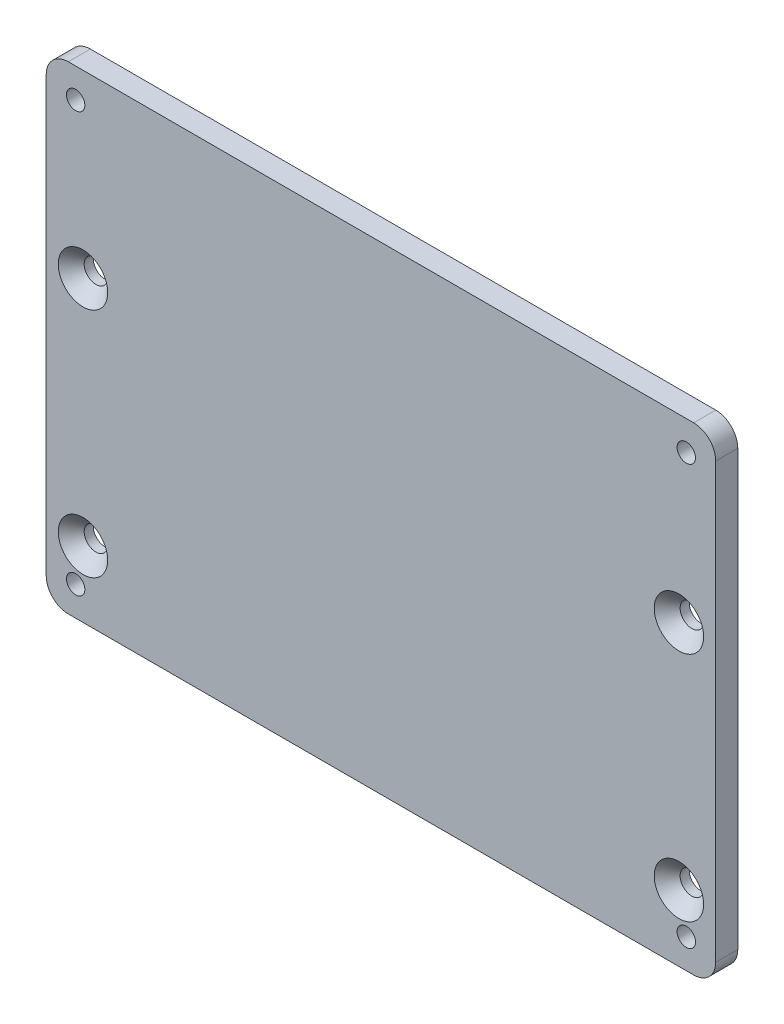
ISO-10303-21;
HEADER;
FILE_DESCRIPTION(('STEP AP214'),'2;1');
FILE_NAME('part.step','',(''),(''),'','','');
FILE_SCHEMA(('AUTOMOTIVE_DESIGN { 1 0 10303 214 1 1 1 1 }'));
ENDSEC;
DATA;
#1=APPLICATION_CONTEXT('core data for automotive mechanical design processes');
#2=APPLICATION_PROTOCOL_DEFINITION('international standard','automotive_design',2000,#1);
#3=PRODUCT_CONTEXT('',#1,'mechanical');
#4=PRODUCT('Part','Part','',(#3));
#5=PRODUCT_RELATED_PRODUCT_CATEGORY('part','',(#4));
#6=PRODUCT_DEFINITION_FORMATION('','',#4);
#7=PRODUCT_DEFINITION_CONTEXT('part definition',#1,'design');
#8=PRODUCT_DEFINITION('design','',#6,#7);
#9=PRODUCT_DEFINITION_SHAPE('','',#8);
#10=(LENGTH_UNIT() NAMED_UNIT(*) SI_UNIT(.MILLI.,.METRE.));
#11=(NAMED_UNIT(*) PLANE_ANGLE_UNIT() SI_UNIT($,.RADIAN.));
#12=(NAMED_UNIT(*) SI_UNIT($,.STERADIAN.) SOLID_ANGLE_UNIT());
#13=UNCERTAINTY_MEASURE_WITH_UNIT(LENGTH_MEASURE(1.E-05),#10,'distance_accuracy_value','');
#14=(GEOMETRIC_REPRESENTATION_CONTEXT(3) GLOBAL_UNCERTAINTY_ASSIGNED_CONTEXT((#13)) GLOBAL_UNIT_ASSIGNED_CONTEXT((#10,
#11,#12)) REPRESENTATION_CONTEXT('',''));
#15=CARTESIAN_POINT('',(0.,0.,0.));
#16=DIRECTION('',(0.,0.,1.));
#17=DIRECTION('',(1.,0.,0.));
#18=AXIS2_PLACEMENT_3D('',#15,#16,#17);
#19=CARTESIAN_POINT('',(-45.5,-32.5,3.));
#20=DIRECTION('',(1.,0.,0.));
#21=DIRECTION('',(0.,0.,-1.));
#22=AXIS2_PLACEMENT_3D('',#19,#20,#21);
#23=PLANE('',#22);
#24=DIRECTION('',(0.,-1.,0.));
#25=VECTOR('',#24,1.);
#26=CARTESIAN_POINT('',(-45.5,-32.5,0.));
#27=LINE('',#26,#25);
#28=CARTESIAN_POINT('',(-45.5,29.5,0.));
#29=VERTEX_POINT('',#28);
#30=CARTESIAN_POINT('',(-45.5,-29.5,0.));
#31=VERTEX_POINT('',#30);
#32=EDGE_CURVE('E161',#29,#31,#27,.T.);
#33=ORIENTED_EDGE('',*,*,#32,.T.);
#34=DIRECTION('',(0.,0.,-1.));
#35=VECTOR('',#34,1.);
#36=CARTESIAN_POINT('',(-45.5,-29.5,3.));
#37=LINE('',#36,#35);
#38=CARTESIAN_POINT('',(-45.5,-29.5,3.));
#39=VERTEX_POINT('',#38);
#40=EDGE_CURVE('E11',#31,#39,#37,.F.);
#41=ORIENTED_EDGE('',*,*,#40,.T.);
#42=DIRECTION('',(0.,-1.,0.));
#43=VECTOR('',#42,1.);
#44=CARTESIAN_POINT('',(-45.5,-32.5,3.));
#45=LINE('',#44,#43);
#46=CARTESIAN_POINT('',(-45.5,29.5,3.));
#47=VERTEX_POINT('',#46);
#48=EDGE_CURVE('E129',#47,#39,#45,.T.);
#49=ORIENTED_EDGE('',*,*,#48,.F.);
#50=DIRECTION('',(0.,0.,-1.));
#51=VECTOR('',#50,1.);
#52=CARTESIAN_POINT('',(-45.5,29.5,3.));
#53=LINE('',#52,#51);
#54=EDGE_CURVE('E45',#47,#29,#53,.T.);
#55=ORIENTED_EDGE('',*,*,#54,.T.);
#56=EDGE_LOOP('',(#33,#41,#49,#55));
#57=FACE_BOUND('',#56,.T.);
#58=ADVANCED_FACE('F37',(#57),#23,.F.);
#59=CARTESIAN_POINT('',(45.5,-32.5,3.));
#60=DIRECTION('',(0.,1.,0.));
#61=DIRECTION('',(-1.,0.,0.));
#62=AXIS2_PLACEMENT_3D('',#59,#60,#61);
#63=PLANE('',#62);
#64=DIRECTION('',(1.,0.,0.));
#65=VECTOR('',#64,1.);
#66=CARTESIAN_POINT('',(45.5,-32.5,0.));
#67=LINE('',#66,#65);
#68=CARTESIAN_POINT('',(-42.5,-32.5,0.));
#69=VERTEX_POINT('',#68);
#70=CARTESIAN_POINT('',(42.5,-32.5,0.));
#71=VERTEX_POINT('',#70);
#72=EDGE_CURVE('E134',#69,#71,#67,.T.);
#73=ORIENTED_EDGE('',*,*,#72,.T.);
#74=DIRECTION('',(0.,0.,-1.));
#75=VECTOR('',#74,1.);
#76=CARTESIAN_POINT('',(42.5,-32.5,3.));
#77=LINE('',#76,#75);
#78=CARTESIAN_POINT('',(42.5,-32.5,3.));
#79=VERTEX_POINT('',#78);
#80=EDGE_CURVE('E52',#71,#79,#77,.F.);
#81=ORIENTED_EDGE('',*,*,#80,.T.);
#82=DIRECTION('',(1.,0.,0.));
#83=VECTOR('',#82,1.);
#84=CARTESIAN_POINT('',(45.5,-32.5,3.));
#85=LINE('',#84,#83);
#86=CARTESIAN_POINT('',(-42.5,-32.5,3.));
#87=VERTEX_POINT('',#86);
#88=EDGE_CURVE('E132',#87,#79,#85,.T.);
#89=ORIENTED_EDGE('',*,*,#88,.F.);
#90=DIRECTION('',(0.,0.,-1.));
#91=VECTOR('',#90,1.);
#92=CARTESIAN_POINT('',(-42.5,-32.5,3.));
#93=LINE('',#92,#91);
#94=EDGE_CURVE('E153',#87,#69,#93,.T.);
#95=ORIENTED_EDGE('',*,*,#94,.T.);
#96=EDGE_LOOP('',(#73,#81,#89,#95));
#97=FACE_BOUND('',#96,.T.);
#98=ADVANCED_FACE('F260',(#97),#63,.F.);
#99=CARTESIAN_POINT('',(45.5,-32.5,3.));
#100=DIRECTION('',(-1.,0.,0.));
#101=DIRECTION('',(0.,0.,1.));
#102=AXIS2_PLACEMENT_3D('',#99,#100,#101);
#103=PLANE('',#102);
#104=DIRECTION('',(0.,1.,0.));
#105=VECTOR('',#104,1.);
#106=CARTESIAN_POINT('',(45.5,-32.5,0.));
#107=LINE('',#106,#105);
#108=CARTESIAN_POINT('',(45.5,-29.5,0.));
#109=VERTEX_POINT('',#108);
#110=CARTESIAN_POINT('',(45.5,29.5,0.));
#111=VERTEX_POINT('',#110);
#112=EDGE_CURVE('E130',#109,#111,#107,.T.);
#113=ORIENTED_EDGE('',*,*,#112,.T.);
#114=DIRECTION('',(0.,0.,-1.));
#115=VECTOR('',#114,1.);
#116=CARTESIAN_POINT('',(45.5,29.5,3.));
#117=LINE('',#116,#115);
#118=CARTESIAN_POINT('',(45.5,29.5,3.));
#119=VERTEX_POINT('',#118);
#120=EDGE_CURVE('E108',#111,#119,#117,.F.);
#121=ORIENTED_EDGE('',*,*,#120,.T.);
#122=DIRECTION('',(0.,1.,0.));
#123=VECTOR('',#122,1.);
#124=CARTESIAN_POINT('',(45.5,-32.5,3.));
#125=LINE('',#124,#123);
#126=CARTESIAN_POINT('',(45.5,-29.5,3.));
#127=VERTEX_POINT('',#126);
#128=EDGE_CURVE('E173',#127,#119,#125,.T.);
#129=ORIENTED_EDGE('',*,*,#128,.F.);
#130=DIRECTION('',(0.,0.,-1.));
#131=VECTOR('',#130,1.);
#132=CARTESIAN_POINT('',(45.5,-29.5,3.));
#133=LINE('',#132,#131);
#134=EDGE_CURVE('E113',#127,#109,#133,.T.);
#135=ORIENTED_EDGE('',*,*,#134,.T.);
#136=EDGE_LOOP('',(#113,#121,#129,#135));
#137=FACE_BOUND('',#136,.T.);
#138=ADVANCED_FACE('F257',(#137),#103,.F.);
#139=CARTESIAN_POINT('',(45.5,32.5,3.));
#140=DIRECTION('',(0.,-1.,0.));
#141=DIRECTION('',(1.,0.,0.));
#142=AXIS2_PLACEMENT_3D('',#139,#140,#141);
#143=PLANE('',#142);
#144=DIRECTION('',(-1.,0.,0.));
#145=VECTOR('',#144,1.);
#146=CARTESIAN_POINT('',(45.5,32.5,3.));
#147=LINE('',#146,#145);
#148=CARTESIAN_POINT('',(42.5,32.5,3.));
#149=VERTEX_POINT('',#148);
#150=CARTESIAN_POINT('',(-42.5,32.5,3.));
#151=VERTEX_POINT('',#150);
#152=EDGE_CURVE('E123',#149,#151,#147,.T.);
#153=ORIENTED_EDGE('',*,*,#152,.F.);
#154=DIRECTION('',(0.,0.,-1.));
#155=VECTOR('',#154,1.);
#156=CARTESIAN_POINT('',(42.5,32.5,3.));
#157=LINE('',#156,#155);
#158=CARTESIAN_POINT('',(42.5,32.5,0.));
#159=VERTEX_POINT('',#158);
#160=EDGE_CURVE('E107',#149,#159,#157,.T.);
#161=ORIENTED_EDGE('',*,*,#160,.T.);
#162=DIRECTION('',(-1.,0.,0.));
#163=VECTOR('',#162,1.);
#164=CARTESIAN_POINT('',(45.5,32.5,0.));
#165=LINE('',#164,#163);
#166=CARTESIAN_POINT('',(-42.5,32.5,0.));
#167=VERTEX_POINT('',#166);
#168=EDGE_CURVE('E120',#159,#167,#165,.T.);
#169=ORIENTED_EDGE('',*,*,#168,.T.);
#170=DIRECTION('',(0.,0.,-1.));
#171=VECTOR('',#170,1.);
#172=CARTESIAN_POINT('',(-42.5,32.5,3.));
#173=LINE('',#172,#171);
#174=EDGE_CURVE('E125',#167,#151,#173,.F.);
#175=ORIENTED_EDGE('',*,*,#174,.T.);
#176=EDGE_LOOP('',(#153,#161,#169,#175));
#177=FACE_BOUND('',#176,.T.);
#178=ADVANCED_FACE('F119',(#177),#143,.F.);
#179=CARTESIAN_POINT('',(0.,0.,3.));
#180=DIRECTION('',(0.,0.,1.));
#181=DIRECTION('',(1.,0.,0.));
#182=AXIS2_PLACEMENT_3D('',#179,#180,#181);
#183=PLANE('',#182);
#184=CARTESIAN_POINT('',(-40.5,7.99999999999999,3.));
#185=DIRECTION('',(0.,0.,1.));
#186=DIRECTION('',(1.,0.,0.));
#187=AXIS2_PLACEMENT_3D('',#184,#185,#186);
#188=CIRCLE('',#187,3.36);
#189=CARTESIAN_POINT('',(-37.14,7.99999999999999,3.));
#190=VERTEX_POINT('',#189);
#191=EDGE_CURVE('E230',#190,#190,#188,.T.);
#192=ORIENTED_EDGE('',*,*,#191,.F.);
#193=EDGE_LOOP('',(#192));
#194=FACE_BOUND('',#193,.T.);
#195=CARTESIAN_POINT('',(-40.5,-23.5,3.));
#196=DIRECTION('',(0.,0.,1.));
#197=DIRECTION('',(1.,0.,0.));
#198=AXIS2_PLACEMENT_3D('',#195,#196,#197);
#199=CIRCLE('',#198,3.36);
#200=CARTESIAN_POINT('',(-37.14,-23.5,3.));
#201=VERTEX_POINT('',#200);
#202=EDGE_CURVE('E221',#201,#201,#199,.T.);
#203=ORIENTED_EDGE('',*,*,#202,.F.);
#204=EDGE_LOOP('',(#203));
#205=FACE_BOUND('',#204,.T.);
#206=CARTESIAN_POINT('',(40.5,-23.5,3.));
#207=DIRECTION('',(0.,0.,1.));
#208=DIRECTION('',(1.,0.,0.));
#209=AXIS2_PLACEMENT_3D('',#206,#207,#208);
#210=CIRCLE('',#209,3.36);
#211=CARTESIAN_POINT('',(43.86,-23.5,3.));
#212=VERTEX_POINT('',#211);
#213=EDGE_CURVE('E212',#212,#212,#210,.T.);
#214=ORIENTED_EDGE('',*,*,#213,.F.);
#215=EDGE_LOOP('',(#214));
#216=FACE_BOUND('',#215,.T.);
#217=CARTESIAN_POINT('',(40.5,8.,3.));
#218=DIRECTION('',(0.,0.,1.));
#219=DIRECTION('',(1.,0.,0.));
#220=AXIS2_PLACEMENT_3D('',#217,#218,#219);
#221=CIRCLE('',#220,3.36);
#222=CARTESIAN_POINT('',(43.86,8.,3.));
#223=VERTEX_POINT('',#222);
#224=EDGE_CURVE('E203',#223,#223,#221,.T.);
#225=ORIENTED_EDGE('',*,*,#224,.F.);
#226=EDGE_LOOP('',(#225));
#227=FACE_BOUND('',#226,.T.);
#228=CARTESIAN_POINT('',(-41.5,28.5,3.));
#229=DIRECTION('',(0.,0.,1.));
#230=DIRECTION('',(1.,0.,0.));
#231=AXIS2_PLACEMENT_3D('',#228,#229,#230);
#232=CIRCLE('',#231,1.24999999999999);
#233=CARTESIAN_POINT('',(-40.25,28.5,3.));
#234=VERTEX_POINT('',#233);
#235=EDGE_CURVE('E194',#234,#234,#232,.T.);
#236=ORIENTED_EDGE('',*,*,#235,.F.);
#237=EDGE_LOOP('',(#236));
#238=FACE_BOUND('',#237,.T.);
#239=CARTESIAN_POINT('',(41.5,28.5,3.));
#240=DIRECTION('',(0.,0.,1.));
#241=DIRECTION('',(1.,0.,0.));
#242=AXIS2_PLACEMENT_3D('',#239,#240,#241);
#243=CIRCLE('',#242,1.24999999999999);
#244=CARTESIAN_POINT('',(42.75,28.5,3.));
#245=VERTEX_POINT('',#244);
#246=EDGE_CURVE('E188',#245,#245,#243,.T.);
#247=ORIENTED_EDGE('',*,*,#246,.F.);
#248=EDGE_LOOP('',(#247));
#249=FACE_BOUND('',#248,.T.);
#250=CARTESIAN_POINT('',(41.5,-28.5,3.));
#251=DIRECTION('',(0.,0.,1.));
#252=DIRECTION('',(1.,0.,0.));
#253=AXIS2_PLACEMENT_3D('',#250,#251,#252);
#254=CIRCLE('',#253,1.24999999999999);
#255=CARTESIAN_POINT('',(42.75,-28.5,3.));
#256=VERTEX_POINT('',#255);
#257=EDGE_CURVE('E182',#256,#256,#254,.T.);
#258=ORIENTED_EDGE('',*,*,#257,.F.);
#259=EDGE_LOOP('',(#258));
#260=FACE_BOUND('',#259,.T.);
#261=CARTESIAN_POINT('',(-41.5,-28.5,3.));
#262=DIRECTION('',(0.,0.,1.));
#263=DIRECTION('',(1.,0.,0.));
#264=AXIS2_PLACEMENT_3D('',#261,#262,#263);
#265=CIRCLE('',#264,1.24999999999999);
#266=CARTESIAN_POINT('',(-40.25,-28.5,3.));
#267=VERTEX_POINT('',#266);
#268=EDGE_CURVE('E169',#267,#267,#265,.T.);
#269=ORIENTED_EDGE('',*,*,#268,.F.);
#270=EDGE_LOOP('',(#269));
#271=FACE_BOUND('',#270,.T.);
#272=ORIENTED_EDGE('',*,*,#128,.T.);
#273=CARTESIAN_POINT('',(42.5,29.5,3.));
#274=DIRECTION('',(0.,0.,1.));
#275=DIRECTION('',(1.,0.,0.));
#276=AXIS2_PLACEMENT_3D('',#273,#274,#275);
#277=CIRCLE('',#276,3.);
#278=EDGE_CURVE('E151',#119,#149,#277,.T.);
#279=ORIENTED_EDGE('',*,*,#278,.T.);
#280=ORIENTED_EDGE('',*,*,#152,.T.);
#281=CARTESIAN_POINT('',(-42.5,29.5,3.));
#282=DIRECTION('',(0.,0.,1.));
#283=DIRECTION('',(1.,0.,0.));
#284=AXIS2_PLACEMENT_3D('',#281,#282,#283);
#285=CIRCLE('',#284,3.);
#286=EDGE_CURVE('E146',#151,#47,#285,.T.);
#287=ORIENTED_EDGE('',*,*,#286,.T.);
#288=ORIENTED_EDGE('',*,*,#48,.T.);
#289=CARTESIAN_POINT('',(-42.5,-29.5,3.));
#290=DIRECTION('',(0.,0.,1.));
#291=DIRECTION('',(1.,0.,0.));
#292=AXIS2_PLACEMENT_3D('',#289,#290,#291);
#293=CIRCLE('',#292,3.);
#294=EDGE_CURVE('E59',#39,#87,#293,.T.);
#295=ORIENTED_EDGE('',*,*,#294,.T.);
#296=ORIENTED_EDGE('',*,*,#88,.T.);
#297=CARTESIAN_POINT('',(42.5,-29.5,3.));
#298=DIRECTION('',(0.,0.,1.));
#299=DIRECTION('',(1.,0.,0.));
#300=AXIS2_PLACEMENT_3D('',#297,#298,#299);
#301=CIRCLE('',#300,3.);
#302=EDGE_CURVE('E149',#79,#127,#301,.T.);
#303=ORIENTED_EDGE('',*,*,#302,.T.);
#304=EDGE_LOOP('',(#272,#279,#280,#287,#288,#295,#296,#303));
#305=FACE_BOUND('',#304,.T.);
#306=ADVANCED_FACE('F236',(#194,#205,#216,#227,#238,#249,#260,#271,#305),#183,.T.);
#307=CARTESIAN_POINT('',(0.,0.,0.));
#308=DIRECTION('',(0.,0.,1.));
#309=DIRECTION('',(1.,0.,0.));
#310=AXIS2_PLACEMENT_3D('',#307,#308,#309);
#311=PLANE('',#310);
#312=CARTESIAN_POINT('',(-40.5,7.99999999999999,0.));
#313=DIRECTION('',(0.,0.,1.));
#314=DIRECTION('',(1.,0.,0.));
#315=AXIS2_PLACEMENT_3D('',#312,#313,#314);
#316=CIRCLE('',#315,1.59999999999999);
#317=CARTESIAN_POINT('',(-38.9,7.99999999999999,0.));
#318=VERTEX_POINT('',#317);
#319=EDGE_CURVE('E224',#318,#318,#316,.T.);
#320=ORIENTED_EDGE('',*,*,#319,.T.);
#321=EDGE_LOOP('',(#320));
#322=FACE_BOUND('',#321,.T.);
#323=CARTESIAN_POINT('',(-40.5,-23.5,0.));
#324=DIRECTION('',(0.,0.,1.));
#325=DIRECTION('',(1.,0.,0.));
#326=AXIS2_PLACEMENT_3D('',#323,#324,#325);
#327=CIRCLE('',#326,1.59999999999999);
#328=CARTESIAN_POINT('',(-38.9,-23.5,0.));
#329=VERTEX_POINT('',#328);
#330=EDGE_CURVE('E215',#329,#329,#327,.T.);
#331=ORIENTED_EDGE('',*,*,#330,.T.);
#332=EDGE_LOOP('',(#331));
#333=FACE_BOUND('',#332,.T.);
#334=CARTESIAN_POINT('',(40.5,-23.5,0.));
#335=DIRECTION('',(0.,0.,1.));
#336=DIRECTION('',(1.,0.,0.));
#337=AXIS2_PLACEMENT_3D('',#334,#335,#336);
#338=CIRCLE('',#337,1.59999999999999);
#339=CARTESIAN_POINT('',(42.1,-23.5,0.));
#340=VERTEX_POINT('',#339);
#341=EDGE_CURVE('E206',#340,#340,#338,.T.);
#342=ORIENTED_EDGE('',*,*,#341,.T.);
#343=EDGE_LOOP('',(#342));
#344=FACE_BOUND('',#343,.T.);
#345=CARTESIAN_POINT('',(40.5,8.,0.));
#346=DIRECTION('',(0.,0.,1.));
#347=DIRECTION('',(1.,0.,0.));
#348=AXIS2_PLACEMENT_3D('',#345,#346,#347);
#349=CIRCLE('',#348,1.59999999999999);
#350=CARTESIAN_POINT('',(42.1,8.,0.));
#351=VERTEX_POINT('',#350);
#352=EDGE_CURVE('E197',#351,#351,#349,.T.);
#353=ORIENTED_EDGE('',*,*,#352,.T.);
#354=EDGE_LOOP('',(#353));
#355=FACE_BOUND('',#354,.T.);
#356=CARTESIAN_POINT('',(-41.5,28.5,0.));
#357=DIRECTION('',(0.,0.,1.));
#358=DIRECTION('',(1.,0.,0.));
#359=AXIS2_PLACEMENT_3D('',#356,#357,#358);
#360=CIRCLE('',#359,1.25);
#361=CARTESIAN_POINT('',(-40.25,28.5,0.));
#362=VERTEX_POINT('',#361);
#363=EDGE_CURVE('E191',#362,#362,#360,.T.);
#364=ORIENTED_EDGE('',*,*,#363,.T.);
#365=EDGE_LOOP('',(#364));
#366=FACE_BOUND('',#365,.T.);
#367=CARTESIAN_POINT('',(41.5,28.5,0.));
#368=DIRECTION('',(0.,0.,1.));
#369=DIRECTION('',(1.,0.,0.));
#370=AXIS2_PLACEMENT_3D('',#367,#368,#369);
#371=CIRCLE('',#370,1.25);
#372=CARTESIAN_POINT('',(42.75,28.5,0.));
#373=VERTEX_POINT('',#372);
#374=EDGE_CURVE('E185',#373,#373,#371,.T.);
#375=ORIENTED_EDGE('',*,*,#374,.T.);
#376=EDGE_LOOP('',(#375));
#377=FACE_BOUND('',#376,.T.);
#378=CARTESIAN_POINT('',(41.5,-28.5,0.));
#379=DIRECTION('',(0.,0.,1.));
#380=DIRECTION('',(1.,0.,0.));
#381=AXIS2_PLACEMENT_3D('',#378,#379,#380);
#382=CIRCLE('',#381,1.25);
#383=CARTESIAN_POINT('',(42.75,-28.5,0.));
#384=VERTEX_POINT('',#383);
#385=EDGE_CURVE('E179',#384,#384,#382,.T.);
#386=ORIENTED_EDGE('',*,*,#385,.T.);
#387=EDGE_LOOP('',(#386));
#388=FACE_BOUND('',#387,.T.);
#389=CARTESIAN_POINT('',(-41.5,-28.5,0.));
#390=DIRECTION('',(0.,0.,1.));
#391=DIRECTION('',(1.,0.,0.));
#392=AXIS2_PLACEMENT_3D('',#389,#390,#391);
#393=CIRCLE('',#392,1.25);
#394=CARTESIAN_POINT('',(-40.25,-28.5,0.));
#395=VERTEX_POINT('',#394);
#396=EDGE_CURVE('E166',#395,#395,#393,.T.);
#397=ORIENTED_EDGE('',*,*,#396,.T.);
#398=EDGE_LOOP('',(#397));
#399=FACE_BOUND('',#398,.T.);
#400=ORIENTED_EDGE('',*,*,#168,.F.);
#401=CARTESIAN_POINT('',(42.5,29.5,0.));
#402=DIRECTION('',(0.,0.,1.));
#403=DIRECTION('',(1.,0.,0.));
#404=AXIS2_PLACEMENT_3D('',#401,#402,#403);
#405=CIRCLE('',#404,3.);
#406=EDGE_CURVE('E103',#159,#111,#405,.F.);
#407=ORIENTED_EDGE('',*,*,#406,.T.);
#408=ORIENTED_EDGE('',*,*,#112,.F.);
#409=CARTESIAN_POINT('',(42.5,-29.5,0.));
#410=DIRECTION('',(0.,0.,1.));
#411=DIRECTION('',(1.,0.,0.));
#412=AXIS2_PLACEMENT_3D('',#409,#410,#411);
#413=CIRCLE('',#412,3.);
#414=EDGE_CURVE('E114',#109,#71,#413,.F.);
#415=ORIENTED_EDGE('',*,*,#414,.T.);
#416=ORIENTED_EDGE('',*,*,#72,.F.);
#417=CARTESIAN_POINT('',(-42.5,-29.5,0.));
#418=DIRECTION('',(0.,0.,1.));
#419=DIRECTION('',(1.,0.,0.));
#420=AXIS2_PLACEMENT_3D('',#417,#418,#419);
#421=CIRCLE('',#420,3.);
#422=EDGE_CURVE('E140',#69,#31,#421,.F.);
#423=ORIENTED_EDGE('',*,*,#422,.T.);
#424=ORIENTED_EDGE('',*,*,#32,.F.);
#425=CARTESIAN_POINT('',(-42.5,29.5,0.));
#426=DIRECTION('',(0.,0.,1.));
#427=DIRECTION('',(1.,0.,0.));
#428=AXIS2_PLACEMENT_3D('',#425,#426,#427);
#429=CIRCLE('',#428,3.);
#430=EDGE_CURVE('E124',#29,#167,#429,.F.);
#431=ORIENTED_EDGE('',*,*,#430,.T.);
#432=EDGE_LOOP('',(#400,#407,#408,#415,#416,#423,#424,#431));
#433=FACE_BOUND('',#432,.T.);
#434=ADVANCED_FACE('F127',(#322,#333,#344,#355,#366,#377,#388,#399,#433),#311,.F.);
#435=CARTESIAN_POINT('',(-41.5,-28.5,3.));
#436=DIRECTION('',(0.,0.,1.));
#437=DIRECTION('',(1.,0.,0.));
#438=AXIS2_PLACEMENT_3D('',#435,#436,#437);
#439=CYLINDRICAL_SURFACE('',#438,1.24999999999999);
#440=ORIENTED_EDGE('',*,*,#396,.F.);
#441=EDGE_LOOP('',(#440));
#442=FACE_BOUND('',#441,.T.);
#443=ORIENTED_EDGE('',*,*,#268,.T.);
#444=EDGE_LOOP('',(#443));
#445=FACE_BOUND('',#444,.T.);
#446=ADVANCED_FACE('F319',(#442,#445),#439,.F.);
#447=CARTESIAN_POINT('',(41.5,-28.5,3.));
#448=DIRECTION('',(0.,0.,1.));
#449=DIRECTION('',(1.,0.,0.));
#450=AXIS2_PLACEMENT_3D('',#447,#448,#449);
#451=CYLINDRICAL_SURFACE('',#450,1.24999999999999);
#452=ORIENTED_EDGE('',*,*,#385,.F.);
#453=EDGE_LOOP('',(#452));
#454=FACE_BOUND('',#453,.T.);
#455=ORIENTED_EDGE('',*,*,#257,.T.);
#456=EDGE_LOOP('',(#455));
#457=FACE_BOUND('',#456,.T.);
#458=ADVANCED_FACE('F441',(#454,#457),#451,.F.);
#459=CARTESIAN_POINT('',(41.5,28.5,3.));
#460=DIRECTION('',(0.,0.,1.));
#461=DIRECTION('',(1.,0.,0.));
#462=AXIS2_PLACEMENT_3D('',#459,#460,#461);
#463=CYLINDRICAL_SURFACE('',#462,1.24999999999999);
#464=ORIENTED_EDGE('',*,*,#374,.F.);
#465=EDGE_LOOP('',(#464));
#466=FACE_BOUND('',#465,.T.);
#467=ORIENTED_EDGE('',*,*,#246,.T.);
#468=EDGE_LOOP('',(#467));
#469=FACE_BOUND('',#468,.T.);
#470=ADVANCED_FACE('F431',(#466,#469),#463,.F.);
#471=CARTESIAN_POINT('',(-41.5,28.5,3.));
#472=DIRECTION('',(0.,0.,1.));
#473=DIRECTION('',(1.,0.,0.));
#474=AXIS2_PLACEMENT_3D('',#471,#472,#473);
#475=CYLINDRICAL_SURFACE('',#474,1.24999999999999);
#476=ORIENTED_EDGE('',*,*,#363,.F.);
#477=EDGE_LOOP('',(#476));
#478=FACE_BOUND('',#477,.T.);
#479=ORIENTED_EDGE('',*,*,#235,.T.);
#480=EDGE_LOOP('',(#479));
#481=FACE_BOUND('',#480,.T.);
#482=ADVANCED_FACE('F283',(#478,#481),#475,.F.);
#483=CARTESIAN_POINT('',(42.5,29.5,3.));
#484=DIRECTION('',(0.,0.,-1.));
#485=DIRECTION('',(-1.,0.,0.));
#486=AXIS2_PLACEMENT_3D('',#483,#484,#485);
#487=CYLINDRICAL_SURFACE('',#486,3.);
#488=ORIENTED_EDGE('',*,*,#278,.F.);
#489=ORIENTED_EDGE('',*,*,#120,.F.);
#490=ORIENTED_EDGE('',*,*,#406,.F.);
#491=ORIENTED_EDGE('',*,*,#160,.F.);
#492=EDGE_LOOP('',(#488,#489,#490,#491));
#493=FACE_BOUND('',#492,.T.);
#494=ADVANCED_FACE('F106',(#493),#487,.T.);
#495=CARTESIAN_POINT('',(42.5,-29.5,3.));
#496=DIRECTION('',(0.,0.,-1.));
#497=DIRECTION('',(-1.,0.,0.));
#498=AXIS2_PLACEMENT_3D('',#495,#496,#497);
#499=CYLINDRICAL_SURFACE('',#498,3.);
#500=ORIENTED_EDGE('',*,*,#302,.F.);
#501=ORIENTED_EDGE('',*,*,#80,.F.);
#502=ORIENTED_EDGE('',*,*,#414,.F.);
#503=ORIENTED_EDGE('',*,*,#134,.F.);
#504=EDGE_LOOP('',(#500,#501,#502,#503));
#505=FACE_BOUND('',#504,.T.);
#506=ADVANCED_FACE('F259',(#505),#499,.T.);
#507=CARTESIAN_POINT('',(-42.5,-29.5,3.));
#508=DIRECTION('',(0.,0.,-1.));
#509=DIRECTION('',(-1.,0.,0.));
#510=AXIS2_PLACEMENT_3D('',#507,#508,#509);
#511=CYLINDRICAL_SURFACE('',#510,3.);
#512=ORIENTED_EDGE('',*,*,#294,.F.);
#513=ORIENTED_EDGE('',*,*,#40,.F.);
#514=ORIENTED_EDGE('',*,*,#422,.F.);
#515=ORIENTED_EDGE('',*,*,#94,.F.);
#516=EDGE_LOOP('',(#512,#513,#514,#515));
#517=FACE_BOUND('',#516,.T.);
#518=ADVANCED_FACE('F263',(#517),#511,.T.);
#519=CARTESIAN_POINT('',(-42.5,29.5,3.));
#520=DIRECTION('',(0.,0.,-1.));
#521=DIRECTION('',(-1.,0.,0.));
#522=AXIS2_PLACEMENT_3D('',#519,#520,#521);
#523=CYLINDRICAL_SURFACE('',#522,3.);
#524=ORIENTED_EDGE('',*,*,#286,.F.);
#525=ORIENTED_EDGE('',*,*,#174,.F.);
#526=ORIENTED_EDGE('',*,*,#430,.F.);
#527=ORIENTED_EDGE('',*,*,#54,.F.);
#528=EDGE_LOOP('',(#524,#525,#526,#527));
#529=FACE_BOUND('',#528,.T.);
#530=ADVANCED_FACE('F39',(#529),#523,.T.);
#531=CARTESIAN_POINT('',(40.5,8.,3.));
#532=DIRECTION('',(0.,0.,1.));
#533=DIRECTION('',(1.,0.,0.));
#534=AXIS2_PLACEMENT_3D('',#531,#532,#533);
#535=CYLINDRICAL_SURFACE('',#534,1.59999999999999);
#536=ORIENTED_EDGE('',*,*,#352,.F.);
#537=EDGE_LOOP('',(#536));
#538=FACE_BOUND('',#537,.T.);
#539=CARTESIAN_POINT('',(40.5,8.,1.24));
#540=DIRECTION('',(0.,0.,1.));
#541=DIRECTION('',(1.,0.,0.));
#542=AXIS2_PLACEMENT_3D('',#539,#540,#541);
#543=CIRCLE('',#542,1.6);
#544=CARTESIAN_POINT('',(42.1,8.,1.24));
#545=VERTEX_POINT('',#544);
#546=EDGE_CURVE('E200',#545,#545,#543,.T.);
#547=ORIENTED_EDGE('',*,*,#546,.T.);
#548=EDGE_LOOP('',(#547));
#549=FACE_BOUND('',#548,.T.);
#550=ADVANCED_FACE('F265',(#538,#549),#535,.F.);
#551=CARTESIAN_POINT('',(40.5,8.,3.));
#552=DIRECTION('',(0.,0.,1.));
#553=DIRECTION('',(1.,0.,0.));
#554=AXIS2_PLACEMENT_3D('',#551,#552,#553);
#555=CONICAL_SURFACE('',#554,3.36,0.78539816339745);
#556=ORIENTED_EDGE('',*,*,#546,.F.);
#557=EDGE_LOOP('',(#556));
#558=FACE_BOUND('',#557,.T.);
#559=ORIENTED_EDGE('',*,*,#224,.T.);
#560=EDGE_LOOP('',(#559));
#561=FACE_BOUND('',#560,.T.);
#562=ADVANCED_FACE('F270',(#558,#561),#555,.F.);
#563=CARTESIAN_POINT('',(40.5,-23.5,3.));
#564=DIRECTION('',(0.,0.,1.));
#565=DIRECTION('',(1.,0.,0.));
#566=AXIS2_PLACEMENT_3D('',#563,#564,#565);
#567=CYLINDRICAL_SURFACE('',#566,1.59999999999999);
#568=ORIENTED_EDGE('',*,*,#341,.F.);
#569=EDGE_LOOP('',(#568));
#570=FACE_BOUND('',#569,.T.);
#571=CARTESIAN_POINT('',(40.5,-23.5,1.24));
#572=DIRECTION('',(0.,0.,1.));
#573=DIRECTION('',(1.,0.,0.));
#574=AXIS2_PLACEMENT_3D('',#571,#572,#573);
#575=CIRCLE('',#574,1.6);
#576=CARTESIAN_POINT('',(42.1,-23.5,1.24));
#577=VERTEX_POINT('',#576);
#578=EDGE_CURVE('E209',#577,#577,#575,.T.);
#579=ORIENTED_EDGE('',*,*,#578,.T.);
#580=EDGE_LOOP('',(#579));
#581=FACE_BOUND('',#580,.T.);
#582=ADVANCED_FACE('F338',(#570,#581),#567,.F.);
#583=CARTESIAN_POINT('',(40.5,-23.5,3.));
#584=DIRECTION('',(0.,0.,1.));
#585=DIRECTION('',(1.,0.,0.));
#586=AXIS2_PLACEMENT_3D('',#583,#584,#585);
#587=CONICAL_SURFACE('',#586,3.36,0.78539816339745);
#588=ORIENTED_EDGE('',*,*,#578,.F.);
#589=EDGE_LOOP('',(#588));
#590=FACE_BOUND('',#589,.T.);
#591=ORIENTED_EDGE('',*,*,#213,.T.);
#592=EDGE_LOOP('',(#591));
#593=FACE_BOUND('',#592,.T.);
#594=ADVANCED_FACE('F349',(#590,#593),#587,.F.);
#595=CARTESIAN_POINT('',(-40.5,-23.5,3.));
#596=DIRECTION('',(0.,0.,1.));
#597=DIRECTION('',(1.,0.,0.));
#598=AXIS2_PLACEMENT_3D('',#595,#596,#597);
#599=CYLINDRICAL_SURFACE('',#598,1.59999999999999);
#600=ORIENTED_EDGE('',*,*,#330,.F.);
#601=EDGE_LOOP('',(#600));
#602=FACE_BOUND('',#601,.T.);
#603=CARTESIAN_POINT('',(-40.5,-23.5,1.24));
#604=DIRECTION('',(0.,0.,1.));
#605=DIRECTION('',(1.,0.,0.));
#606=AXIS2_PLACEMENT_3D('',#603,#604,#605);
#607=CIRCLE('',#606,1.6);
#608=CARTESIAN_POINT('',(-38.9,-23.5,1.24));
#609=VERTEX_POINT('',#608);
#610=EDGE_CURVE('E218',#609,#609,#607,.T.);
#611=ORIENTED_EDGE('',*,*,#610,.T.);
#612=EDGE_LOOP('',(#611));
#613=FACE_BOUND('',#612,.T.);
#614=ADVANCED_FACE('F360',(#602,#613),#599,.F.);
#615=CARTESIAN_POINT('',(-40.5,-23.5,3.));
#616=DIRECTION('',(0.,0.,1.));
#617=DIRECTION('',(1.,0.,0.));
#618=AXIS2_PLACEMENT_3D('',#615,#616,#617);
#619=CONICAL_SURFACE('',#618,3.36,0.78539816339745);
#620=ORIENTED_EDGE('',*,*,#610,.F.);
#621=EDGE_LOOP('',(#620));
#622=FACE_BOUND('',#621,.T.);
#623=ORIENTED_EDGE('',*,*,#202,.T.);
#624=EDGE_LOOP('',(#623));
#625=FACE_BOUND('',#624,.T.);
#626=ADVANCED_FACE('F371',(#622,#625),#619,.F.);
#627=CARTESIAN_POINT('',(-40.5,7.99999999999999,3.));
#628=DIRECTION('',(0.,0.,1.));
#629=DIRECTION('',(1.,0.,0.));
#630=AXIS2_PLACEMENT_3D('',#627,#628,#629);
#631=CYLINDRICAL_SURFACE('',#630,1.59999999999999);
#632=ORIENTED_EDGE('',*,*,#319,.F.);
#633=EDGE_LOOP('',(#632));
#634=FACE_BOUND('',#633,.T.);
#635=CARTESIAN_POINT('',(-40.5,7.99999999999999,1.24));
#636=DIRECTION('',(0.,0.,1.));
#637=DIRECTION('',(1.,0.,0.));
#638=AXIS2_PLACEMENT_3D('',#635,#636,#637);
#639=CIRCLE('',#638,1.6);
#640=CARTESIAN_POINT('',(-38.9,7.99999999999999,1.24));
#641=VERTEX_POINT('',#640);
#642=EDGE_CURVE('E227',#641,#641,#639,.T.);
#643=ORIENTED_EDGE('',*,*,#642,.T.);
#644=EDGE_LOOP('',(#643));
#645=FACE_BOUND('',#644,.T.);
#646=ADVANCED_FACE('F382',(#634,#645),#631,.F.);
#647=CARTESIAN_POINT('',(-40.5,7.99999999999999,3.));
#648=DIRECTION('',(0.,0.,1.));
#649=DIRECTION('',(1.,0.,0.));
#650=AXIS2_PLACEMENT_3D('',#647,#648,#649);
#651=CONICAL_SURFACE('',#650,3.36,0.78539816339745);
#652=ORIENTED_EDGE('',*,*,#642,.F.);
#653=EDGE_LOOP('',(#652));
#654=FACE_BOUND('',#653,.T.);
#655=ORIENTED_EDGE('',*,*,#191,.T.);
#656=EDGE_LOOP('',(#655));
#657=FACE_BOUND('',#656,.T.);
#658=ADVANCED_FACE('F234',(#654,#657),#651,.F.);
#659=CLOSED_SHELL('',(#58,#98,#138,#178,#306,#434,#446,#458,#470,#482,#494,#506,#518,#530,#550,
#562,#582,#594,#614,#626,#646,#658));
#660=MANIFOLD_SOLID_BREP('B2',#659);
#661=ADVANCED_BREP_SHAPE_REPRESENTATION('',(#18,#660),#14);
#662=SHAPE_DEFINITION_REPRESENTATION(#9,#661);
ENDSEC;
END-ISO-10303-21;
